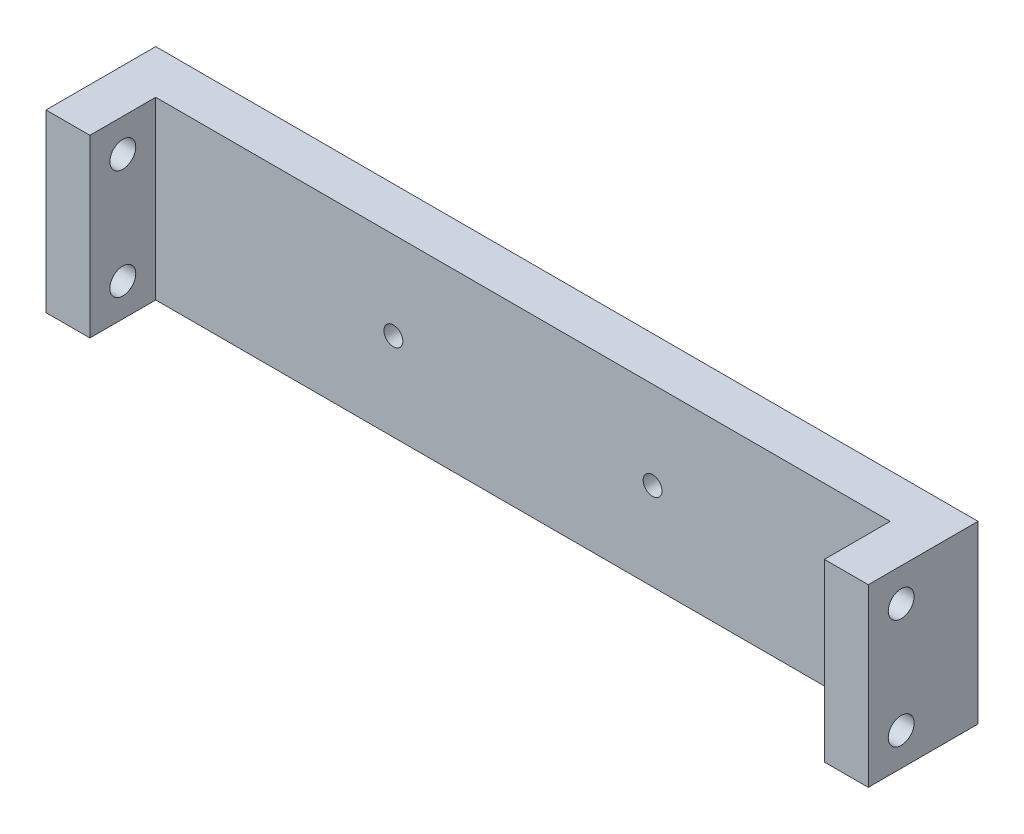
ISO-10303-21;
HEADER;
FILE_DESCRIPTION(('STEP AP214'),'2;1');
FILE_NAME('part.step','',(''),(''),'','','');
FILE_SCHEMA(('AUTOMOTIVE_DESIGN { 1 0 10303 214 1 1 1 1 }'));
ENDSEC;
DATA;
#1=APPLICATION_CONTEXT('core data for automotive mechanical design processes');
#2=APPLICATION_PROTOCOL_DEFINITION('international standard','automotive_design',2000,#1);
#3=PRODUCT_CONTEXT('',#1,'mechanical');
#4=PRODUCT('Part','Part','',(#3));
#5=PRODUCT_RELATED_PRODUCT_CATEGORY('part','',(#4));
#6=PRODUCT_DEFINITION_FORMATION('','',#4);
#7=PRODUCT_DEFINITION_CONTEXT('part definition',#1,'design');
#8=PRODUCT_DEFINITION('design','',#6,#7);
#9=PRODUCT_DEFINITION_SHAPE('','',#8);
#10=(LENGTH_UNIT() NAMED_UNIT(*) SI_UNIT(.MILLI.,.METRE.));
#11=(NAMED_UNIT(*) PLANE_ANGLE_UNIT() SI_UNIT($,.RADIAN.));
#12=(NAMED_UNIT(*) SI_UNIT($,.STERADIAN.) SOLID_ANGLE_UNIT());
#13=UNCERTAINTY_MEASURE_WITH_UNIT(LENGTH_MEASURE(1.E-05),#10,'distance_accuracy_value','');
#14=(GEOMETRIC_REPRESENTATION_CONTEXT(3) GLOBAL_UNCERTAINTY_ASSIGNED_CONTEXT((#13)) GLOBAL_UNIT_ASSIGNED_CONTEXT((#10,
#11,#12)) REPRESENTATION_CONTEXT('',''));
#15=CARTESIAN_POINT('',(0.,0.,0.));
#16=DIRECTION('',(0.,0.,1.));
#17=DIRECTION('',(1.,0.,0.));
#18=AXIS2_PLACEMENT_3D('',#15,#16,#17);
#19=CARTESIAN_POINT('',(0.,0.,5.07999999999997));
#20=DIRECTION('',(0.,1.,0.));
#21=DIRECTION('',(0.,0.,1.));
#22=AXIS2_PLACEMENT_3D('',#19,#20,#21);
#23=PLANE('',#22);
#24=DIRECTION('',(1.,0.,0.));
#25=VECTOR('',#24,1.);
#26=CARTESIAN_POINT('',(0.,0.,0.));
#27=LINE('',#26,#25);
#28=CARTESIAN_POINT('',(0.,0.,0.));
#29=VERTEX_POINT('',#28);
#30=CARTESIAN_POINT('',(95.1738,0.,0.));
#31=VERTEX_POINT('',#30);
#32=EDGE_CURVE('E212',#29,#31,#27,.T.);
#33=ORIENTED_EDGE('',*,*,#32,.T.);
#34=DIRECTION('',(0.,0.,-1.));
#35=VECTOR('',#34,1.);
#36=CARTESIAN_POINT('',(95.1738,0.,12.7));
#37=LINE('',#36,#35);
#38=CARTESIAN_POINT('',(95.1738,0.,12.7));
#39=VERTEX_POINT('',#38);
#40=EDGE_CURVE('E186',#39,#31,#37,.T.);
#41=ORIENTED_EDGE('',*,*,#40,.F.);
#42=DIRECTION('',(1.,0.,0.));
#43=VECTOR('',#42,1.);
#44=CARTESIAN_POINT('',(0.,0.,12.7));
#45=LINE('',#44,#43);
#46=CARTESIAN_POINT('',(90.0938,0.,12.7));
#47=VERTEX_POINT('',#46);
#48=EDGE_CURVE('E157',#47,#39,#45,.T.);
#49=ORIENTED_EDGE('',*,*,#48,.F.);
#50=DIRECTION('',(0.,0.,-1.));
#51=VECTOR('',#50,1.);
#52=CARTESIAN_POINT('',(90.0938,0.,12.7));
#53=LINE('',#52,#51);
#54=CARTESIAN_POINT('',(90.0938,0.,5.07999999999997));
#55=VERTEX_POINT('',#54);
#56=EDGE_CURVE('E171',#47,#55,#53,.T.);
#57=ORIENTED_EDGE('',*,*,#56,.T.);
#58=DIRECTION('',(1.,0.,0.));
#59=VECTOR('',#58,1.);
#60=CARTESIAN_POINT('',(0.,0.,5.07999999999997));
#61=LINE('',#60,#59);
#62=CARTESIAN_POINT('',(5.08000000000003,0.,5.07999999999997));
#63=VERTEX_POINT('',#62);
#64=EDGE_CURVE('E201',#63,#55,#61,.T.);
#65=ORIENTED_EDGE('',*,*,#64,.F.);
#66=DIRECTION('',(0.,0.,-1.));
#67=VECTOR('',#66,1.);
#68=CARTESIAN_POINT('',(5.08000000000003,0.,12.7));
#69=LINE('',#68,#67);
#70=CARTESIAN_POINT('',(5.08000000000003,0.,12.7));
#71=VERTEX_POINT('',#70);
#72=EDGE_CURVE('E68',#71,#63,#69,.T.);
#73=ORIENTED_EDGE('',*,*,#72,.F.);
#74=DIRECTION('',(1.,0.,0.));
#75=VECTOR('',#74,1.);
#76=CARTESIAN_POINT('',(0.,0.,12.7));
#77=LINE('',#76,#75);
#78=CARTESIAN_POINT('',(0.,0.,12.7));
#79=VERTEX_POINT('',#78);
#80=EDGE_CURVE('E129',#79,#71,#77,.T.);
#81=ORIENTED_EDGE('',*,*,#80,.F.);
#82=DIRECTION('',(0.,0.,-1.));
#83=VECTOR('',#82,1.);
#84=CARTESIAN_POINT('',(0.,0.,12.7));
#85=LINE('',#84,#83);
#86=EDGE_CURVE('E151',#79,#29,#85,.T.);
#87=ORIENTED_EDGE('',*,*,#86,.T.);
#88=EDGE_LOOP('',(#33,#41,#49,#57,#65,#73,#81,#87));
#89=FACE_BOUND('',#88,.T.);
#90=ADVANCED_FACE('F44',(#89),#23,.F.);
#91=CARTESIAN_POINT('',(62.5869,10.16,5.07999999999997));
#92=DIRECTION('',(0.,0.,-1.));
#93=DIRECTION('',(-1.,0.,0.));
#94=AXIS2_PLACEMENT_3D('',#91,#92,#93);
#95=CYLINDRICAL_SURFACE('',#94,1.0922);
#96=CARTESIAN_POINT('',(62.5869,10.16,5.07999999999997));
#97=DIRECTION('',(0.,0.,1.));
#98=DIRECTION('',(1.,0.,0.));
#99=AXIS2_PLACEMENT_3D('',#96,#97,#98);
#100=CIRCLE('',#99,1.0922);
#101=CARTESIAN_POINT('',(63.6791,10.16,5.07999999999997));
#102=VERTEX_POINT('',#101);
#103=EDGE_CURVE('E195',#102,#102,#100,.T.);
#104=ORIENTED_EDGE('',*,*,#103,.T.);
#105=EDGE_LOOP('',(#104));
#106=FACE_BOUND('',#105,.T.);
#107=CARTESIAN_POINT('',(62.5869,10.16,0.));
#108=DIRECTION('',(0.,0.,1.));
#109=DIRECTION('',(1.,0.,0.));
#110=AXIS2_PLACEMENT_3D('',#107,#108,#109);
#111=CIRCLE('',#110,1.0922);
#112=CARTESIAN_POINT('',(63.6791,10.16,0.));
#113=VERTEX_POINT('',#112);
#114=EDGE_CURVE('E209',#113,#113,#111,.T.);
#115=ORIENTED_EDGE('',*,*,#114,.F.);
#116=EDGE_LOOP('',(#115));
#117=FACE_BOUND('',#116,.T.);
#118=ADVANCED_FACE('F251',(#106,#117),#95,.F.);
#119=CARTESIAN_POINT('',(32.5869,10.16,5.07999999999997));
#120=DIRECTION('',(0.,0.,-1.));
#121=DIRECTION('',(-1.,0.,0.));
#122=AXIS2_PLACEMENT_3D('',#119,#120,#121);
#123=CYLINDRICAL_SURFACE('',#122,1.09219999999999);
#124=CARTESIAN_POINT('',(32.5869,10.16,5.07999999999997));
#125=DIRECTION('',(0.,0.,1.));
#126=DIRECTION('',(1.,0.,0.));
#127=AXIS2_PLACEMENT_3D('',#124,#125,#126);
#128=CIRCLE('',#127,1.09219999999999);
#129=CARTESIAN_POINT('',(33.6791,10.16,5.07999999999997));
#130=VERTEX_POINT('',#129);
#131=EDGE_CURVE('E191',#130,#130,#128,.T.);
#132=ORIENTED_EDGE('',*,*,#131,.T.);
#133=EDGE_LOOP('',(#132));
#134=FACE_BOUND('',#133,.T.);
#135=CARTESIAN_POINT('',(32.5869,10.16,0.));
#136=DIRECTION('',(0.,0.,1.));
#137=DIRECTION('',(1.,0.,0.));
#138=AXIS2_PLACEMENT_3D('',#135,#136,#137);
#139=CIRCLE('',#138,1.09219999999999);
#140=CARTESIAN_POINT('',(33.6791,10.16,0.));
#141=VERTEX_POINT('',#140);
#142=EDGE_CURVE('E190',#141,#141,#139,.T.);
#143=ORIENTED_EDGE('',*,*,#142,.F.);
#144=EDGE_LOOP('',(#143));
#145=FACE_BOUND('',#144,.T.);
#146=ADVANCED_FACE('F46',(#134,#145),#123,.F.);
#147=CARTESIAN_POINT('',(0.,20.32,5.07999999999997));
#148=DIRECTION('',(0.,1.,0.));
#149=DIRECTION('',(0.,0.,1.));
#150=AXIS2_PLACEMENT_3D('',#147,#148,#149);
#151=PLANE('',#150);
#152=DIRECTION('',(1.,0.,0.));
#153=VECTOR('',#152,1.);
#154=CARTESIAN_POINT('',(0.,20.32,0.));
#155=LINE('',#154,#153);
#156=CARTESIAN_POINT('',(0.,20.32,0.));
#157=VERTEX_POINT('',#156);
#158=CARTESIAN_POINT('',(95.1738,20.32,0.));
#159=VERTEX_POINT('',#158);
#160=EDGE_CURVE('E48',#157,#159,#155,.T.);
#161=ORIENTED_EDGE('',*,*,#160,.F.);
#162=DIRECTION('',(0.,0.,-1.));
#163=VECTOR('',#162,1.);
#164=CARTESIAN_POINT('',(0.,20.32,12.7));
#165=LINE('',#164,#163);
#166=CARTESIAN_POINT('',(0.,20.32,12.7));
#167=VERTEX_POINT('',#166);
#168=EDGE_CURVE('E120',#167,#157,#165,.T.);
#169=ORIENTED_EDGE('',*,*,#168,.F.);
#170=DIRECTION('',(1.,0.,0.));
#171=VECTOR('',#170,1.);
#172=CARTESIAN_POINT('',(0.,20.32,12.7));
#173=LINE('',#172,#171);
#174=CARTESIAN_POINT('',(5.08000000000003,20.32,12.7));
#175=VERTEX_POINT('',#174);
#176=EDGE_CURVE('E126',#167,#175,#173,.T.);
#177=ORIENTED_EDGE('',*,*,#176,.T.);
#178=DIRECTION('',(0.,0.,-1.));
#179=VECTOR('',#178,1.);
#180=CARTESIAN_POINT('',(5.08000000000003,20.32,12.7));
#181=LINE('',#180,#179);
#182=CARTESIAN_POINT('',(5.08000000000003,20.32,5.07999999999997));
#183=VERTEX_POINT('',#182);
#184=EDGE_CURVE('E110',#175,#183,#181,.T.);
#185=ORIENTED_EDGE('',*,*,#184,.T.);
#186=DIRECTION('',(1.,0.,0.));
#187=VECTOR('',#186,1.);
#188=CARTESIAN_POINT('',(0.,20.32,5.07999999999997));
#189=LINE('',#188,#187);
#190=CARTESIAN_POINT('',(90.0938,20.32,5.07999999999997));
#191=VERTEX_POINT('',#190);
#192=EDGE_CURVE('E11',#183,#191,#189,.T.);
#193=ORIENTED_EDGE('',*,*,#192,.T.);
#194=DIRECTION('',(0.,0.,-1.));
#195=VECTOR('',#194,1.);
#196=CARTESIAN_POINT('',(90.0938,20.32,12.7));
#197=LINE('',#196,#195);
#198=CARTESIAN_POINT('',(90.0938,20.32,12.7));
#199=VERTEX_POINT('',#198);
#200=EDGE_CURVE('E178',#199,#191,#197,.T.);
#201=ORIENTED_EDGE('',*,*,#200,.F.);
#202=DIRECTION('',(1.,0.,0.));
#203=VECTOR('',#202,1.);
#204=CARTESIAN_POINT('',(0.,20.32,12.7));
#205=LINE('',#204,#203);
#206=CARTESIAN_POINT('',(95.1738,20.32,12.7));
#207=VERTEX_POINT('',#206);
#208=EDGE_CURVE('E164',#199,#207,#205,.T.);
#209=ORIENTED_EDGE('',*,*,#208,.T.);
#210=DIRECTION('',(0.,0.,-1.));
#211=VECTOR('',#210,1.);
#212=CARTESIAN_POINT('',(95.1738,20.32,12.7));
#213=LINE('',#212,#211);
#214=EDGE_CURVE('E182',#207,#159,#213,.T.);
#215=ORIENTED_EDGE('',*,*,#214,.T.);
#216=EDGE_LOOP('',(#161,#169,#177,#185,#193,#201,#209,#215));
#217=FACE_BOUND('',#216,.T.);
#218=ADVANCED_FACE('F133',(#217),#151,.T.);
#219=CARTESIAN_POINT('',(0.,0.,5.07999999999997));
#220=DIRECTION('',(0.,0.,1.));
#221=DIRECTION('',(1.,0.,0.));
#222=AXIS2_PLACEMENT_3D('',#219,#220,#221);
#223=PLANE('',#222);
#224=ORIENTED_EDGE('',*,*,#131,.F.);
#225=EDGE_LOOP('',(#224));
#226=FACE_BOUND('',#225,.T.);
#227=ORIENTED_EDGE('',*,*,#103,.F.);
#228=EDGE_LOOP('',(#227));
#229=FACE_BOUND('',#228,.T.);
#230=DIRECTION('',(0.,-1.,0.));
#231=VECTOR('',#230,1.);
#232=CARTESIAN_POINT('',(5.08000000000003,0.,5.07999999999997));
#233=LINE('',#232,#231);
#234=EDGE_CURVE('E115',#183,#63,#233,.T.);
#235=ORIENTED_EDGE('',*,*,#234,.T.);
#236=ORIENTED_EDGE('',*,*,#64,.T.);
#237=DIRECTION('',(0.,-1.,0.));
#238=VECTOR('',#237,1.);
#239=CARTESIAN_POINT('',(90.0938,0.,5.07999999999997));
#240=LINE('',#239,#238);
#241=EDGE_CURVE('E54',#191,#55,#240,.T.);
#242=ORIENTED_EDGE('',*,*,#241,.F.);
#243=ORIENTED_EDGE('',*,*,#192,.F.);
#244=EDGE_LOOP('',(#235,#236,#242,#243));
#245=FACE_BOUND('',#244,.T.);
#246=ADVANCED_FACE('F234',(#226,#229,#245),#223,.T.);
#247=CARTESIAN_POINT('',(0.,0.,0.));
#248=DIRECTION('',(0.,0.,1.));
#249=DIRECTION('',(1.,0.,0.));
#250=AXIS2_PLACEMENT_3D('',#247,#248,#249);
#251=PLANE('',#250);
#252=ORIENTED_EDGE('',*,*,#142,.T.);
#253=EDGE_LOOP('',(#252));
#254=FACE_BOUND('',#253,.T.);
#255=ORIENTED_EDGE('',*,*,#114,.T.);
#256=EDGE_LOOP('',(#255));
#257=FACE_BOUND('',#256,.T.);
#258=ORIENTED_EDGE('',*,*,#32,.F.);
#259=DIRECTION('',(0.,1.,0.));
#260=VECTOR('',#259,1.);
#261=CARTESIAN_POINT('',(0.,0.,0.));
#262=LINE('',#261,#260);
#263=EDGE_CURVE('E131',#29,#157,#262,.T.);
#264=ORIENTED_EDGE('',*,*,#263,.T.);
#265=ORIENTED_EDGE('',*,*,#160,.T.);
#266=DIRECTION('',(0.,1.,0.));
#267=VECTOR('',#266,1.);
#268=CARTESIAN_POINT('',(95.1738,0.,0.));
#269=LINE('',#268,#267);
#270=EDGE_CURVE('E119',#31,#159,#269,.T.);
#271=ORIENTED_EDGE('',*,*,#270,.F.);
#272=EDGE_LOOP('',(#258,#264,#265,#271));
#273=FACE_BOUND('',#272,.T.);
#274=ADVANCED_FACE('F221',(#254,#257,#273),#251,.F.);
#275=CARTESIAN_POINT('',(90.0938,0.,12.7));
#276=DIRECTION('',(1.,0.,0.));
#277=DIRECTION('',(0.,0.,-1.));
#278=AXIS2_PLACEMENT_3D('',#275,#276,#277);
#279=PLANE('',#278);
#280=CARTESIAN_POINT('',(90.0938,16.51,8.89000000000001));
#281=DIRECTION('',(1.,0.,0.));
#282=DIRECTION('',(0.,0.,-1.));
#283=AXIS2_PLACEMENT_3D('',#280,#281,#282);
#284=CIRCLE('',#283,1.5);
#285=CARTESIAN_POINT('',(90.0938,16.51,7.39000000000001));
#286=VERTEX_POINT('',#285);
#287=EDGE_CURVE('E148',#286,#286,#284,.F.);
#288=ORIENTED_EDGE('',*,*,#287,.F.);
#289=EDGE_LOOP('',(#288));
#290=FACE_BOUND('',#289,.T.);
#291=CARTESIAN_POINT('',(90.0938,3.81000000000004,8.89000000000001));
#292=DIRECTION('',(1.,0.,0.));
#293=DIRECTION('',(0.,0.,-1.));
#294=AXIS2_PLACEMENT_3D('',#291,#292,#293);
#295=CIRCLE('',#294,1.5);
#296=CARTESIAN_POINT('',(90.0938,3.81000000000004,7.39000000000001));
#297=VERTEX_POINT('',#296);
#298=EDGE_CURVE('E343',#297,#297,#295,.F.);
#299=ORIENTED_EDGE('',*,*,#298,.F.);
#300=EDGE_LOOP('',(#299));
#301=FACE_BOUND('',#300,.T.);
#302=ORIENTED_EDGE('',*,*,#200,.T.);
#303=ORIENTED_EDGE('',*,*,#241,.T.);
#304=ORIENTED_EDGE('',*,*,#56,.F.);
#305=DIRECTION('',(0.,-1.,0.));
#306=VECTOR('',#305,1.);
#307=CARTESIAN_POINT('',(90.0938,0.,12.7));
#308=LINE('',#307,#306);
#309=EDGE_CURVE('E168',#199,#47,#308,.T.);
#310=ORIENTED_EDGE('',*,*,#309,.F.);
#311=EDGE_LOOP('',(#302,#303,#304,#310));
#312=FACE_BOUND('',#311,.T.);
#313=ADVANCED_FACE('F233',(#290,#301,#312),#279,.F.);
#314=CARTESIAN_POINT('',(95.1738,0.,12.7));
#315=DIRECTION('',(-1.,0.,0.));
#316=DIRECTION('',(0.,0.,1.));
#317=AXIS2_PLACEMENT_3D('',#314,#315,#316);
#318=PLANE('',#317);
#319=CARTESIAN_POINT('',(95.1738,16.51,8.89000000000001));
#320=DIRECTION('',(-1.,0.,0.));
#321=DIRECTION('',(0.,0.,1.));
#322=AXIS2_PLACEMENT_3D('',#319,#320,#321);
#323=CIRCLE('',#322,1.5);
#324=CARTESIAN_POINT('',(95.1738,16.51,10.39));
#325=VERTEX_POINT('',#324);
#326=EDGE_CURVE('E335',#325,#325,#323,.T.);
#327=ORIENTED_EDGE('',*,*,#326,.T.);
#328=EDGE_LOOP('',(#327));
#329=FACE_BOUND('',#328,.T.);
#330=CARTESIAN_POINT('',(95.1738,3.81000000000004,8.89000000000001));
#331=DIRECTION('',(-1.,0.,0.));
#332=DIRECTION('',(0.,0.,1.));
#333=AXIS2_PLACEMENT_3D('',#330,#331,#332);
#334=CIRCLE('',#333,1.5);
#335=CARTESIAN_POINT('',(95.1738,3.81000000000004,10.39));
#336=VERTEX_POINT('',#335);
#337=EDGE_CURVE('E358',#336,#336,#334,.T.);
#338=ORIENTED_EDGE('',*,*,#337,.T.);
#339=EDGE_LOOP('',(#338));
#340=FACE_BOUND('',#339,.T.);
#341=ORIENTED_EDGE('',*,*,#270,.T.);
#342=ORIENTED_EDGE('',*,*,#214,.F.);
#343=DIRECTION('',(0.,1.,0.));
#344=VECTOR('',#343,1.);
#345=CARTESIAN_POINT('',(95.1738,0.,12.7));
#346=LINE('',#345,#344);
#347=EDGE_CURVE('E161',#39,#207,#346,.T.);
#348=ORIENTED_EDGE('',*,*,#347,.F.);
#349=ORIENTED_EDGE('',*,*,#40,.T.);
#350=EDGE_LOOP('',(#341,#342,#348,#349));
#351=FACE_BOUND('',#350,.T.);
#352=ADVANCED_FACE('F226',(#329,#340,#351),#318,.F.);
#353=CARTESIAN_POINT('',(0.,0.,12.7));
#354=DIRECTION('',(0.,0.,1.));
#355=DIRECTION('',(1.,0.,0.));
#356=AXIS2_PLACEMENT_3D('',#353,#354,#355);
#357=PLANE('',#356);
#358=ORIENTED_EDGE('',*,*,#48,.T.);
#359=ORIENTED_EDGE('',*,*,#347,.T.);
#360=ORIENTED_EDGE('',*,*,#208,.F.);
#361=ORIENTED_EDGE('',*,*,#309,.T.);
#362=EDGE_LOOP('',(#358,#359,#360,#361));
#363=FACE_BOUND('',#362,.T.);
#364=ADVANCED_FACE('F230',(#363),#357,.T.);
#365=CARTESIAN_POINT('',(5.08000000000003,0.,12.7));
#366=DIRECTION('',(1.,0.,0.));
#367=DIRECTION('',(0.,1.,0.));
#368=AXIS2_PLACEMENT_3D('',#365,#366,#367);
#369=PLANE('',#368);
#370=CARTESIAN_POINT('',(5.08000000000003,16.51,8.89000000000001));
#371=DIRECTION('',(1.,0.,0.));
#372=DIRECTION('',(0.,1.,0.));
#373=AXIS2_PLACEMENT_3D('',#370,#371,#372);
#374=CIRCLE('',#373,1.5);
#375=CARTESIAN_POINT('',(5.08000000000003,18.01,8.89000000000001));
#376=VERTEX_POINT('',#375);
#377=EDGE_CURVE('E339',#376,#376,#374,.F.);
#378=ORIENTED_EDGE('',*,*,#377,.T.);
#379=EDGE_LOOP('',(#378));
#380=FACE_BOUND('',#379,.T.);
#381=CARTESIAN_POINT('',(5.08000000000003,3.81000000000004,8.89000000000001));
#382=DIRECTION('',(1.,0.,0.));
#383=DIRECTION('',(0.,1.,0.));
#384=AXIS2_PLACEMENT_3D('',#381,#382,#383);
#385=CIRCLE('',#384,1.5);
#386=CARTESIAN_POINT('',(5.08000000000003,5.31000000000003,8.89000000000001));
#387=VERTEX_POINT('',#386);
#388=EDGE_CURVE('E349',#387,#387,#385,.F.);
#389=ORIENTED_EDGE('',*,*,#388,.T.);
#390=EDGE_LOOP('',(#389));
#391=FACE_BOUND('',#390,.T.);
#392=ORIENTED_EDGE('',*,*,#234,.F.);
#393=ORIENTED_EDGE('',*,*,#184,.F.);
#394=DIRECTION('',(0.,-1.,0.));
#395=VECTOR('',#394,1.);
#396=CARTESIAN_POINT('',(5.08000000000003,0.,12.7));
#397=LINE('',#396,#395);
#398=EDGE_CURVE('E113',#175,#71,#397,.T.);
#399=ORIENTED_EDGE('',*,*,#398,.T.);
#400=ORIENTED_EDGE('',*,*,#72,.T.);
#401=EDGE_LOOP('',(#392,#393,#399,#400));
#402=FACE_BOUND('',#401,.T.);
#403=ADVANCED_FACE('F112',(#380,#391,#402),#369,.T.);
#404=CARTESIAN_POINT('',(0.,0.,12.7));
#405=DIRECTION('',(-1.,0.,0.));
#406=DIRECTION('',(0.,0.,1.));
#407=AXIS2_PLACEMENT_3D('',#404,#405,#406);
#408=PLANE('',#407);
#409=CARTESIAN_POINT('',(0.,16.51,8.89000000000001));
#410=DIRECTION('',(-1.,0.,0.));
#411=DIRECTION('',(0.,0.,1.));
#412=AXIS2_PLACEMENT_3D('',#409,#410,#411);
#413=CIRCLE('',#412,1.5);
#414=CARTESIAN_POINT('',(0.,16.51,10.39));
#415=VERTEX_POINT('',#414);
#416=EDGE_CURVE('E353',#415,#415,#413,.T.);
#417=ORIENTED_EDGE('',*,*,#416,.F.);
#418=EDGE_LOOP('',(#417));
#419=FACE_BOUND('',#418,.T.);
#420=CARTESIAN_POINT('',(0.,3.81000000000004,8.89000000000001));
#421=DIRECTION('',(-1.,0.,0.));
#422=DIRECTION('',(0.,0.,1.));
#423=AXIS2_PLACEMENT_3D('',#420,#421,#422);
#424=CIRCLE('',#423,1.5);
#425=CARTESIAN_POINT('',(0.,3.81000000000004,10.39));
#426=VERTEX_POINT('',#425);
#427=EDGE_CURVE('E354',#426,#426,#424,.T.);
#428=ORIENTED_EDGE('',*,*,#427,.F.);
#429=EDGE_LOOP('',(#428));
#430=FACE_BOUND('',#429,.T.);
#431=ORIENTED_EDGE('',*,*,#263,.F.);
#432=ORIENTED_EDGE('',*,*,#86,.F.);
#433=DIRECTION('',(0.,1.,0.));
#434=VECTOR('',#433,1.);
#435=CARTESIAN_POINT('',(0.,0.,12.7));
#436=LINE('',#435,#434);
#437=EDGE_CURVE('E136',#79,#167,#436,.T.);
#438=ORIENTED_EDGE('',*,*,#437,.T.);
#439=ORIENTED_EDGE('',*,*,#168,.T.);
#440=EDGE_LOOP('',(#431,#432,#438,#439));
#441=FACE_BOUND('',#440,.T.);
#442=ADVANCED_FACE('F236',(#419,#430,#441),#408,.T.);
#443=CARTESIAN_POINT('',(0.,0.,12.7));
#444=DIRECTION('',(0.,0.,1.));
#445=DIRECTION('',(1.,0.,0.));
#446=AXIS2_PLACEMENT_3D('',#443,#444,#445);
#447=PLANE('',#446);
#448=ORIENTED_EDGE('',*,*,#398,.F.);
#449=ORIENTED_EDGE('',*,*,#176,.F.);
#450=ORIENTED_EDGE('',*,*,#437,.F.);
#451=ORIENTED_EDGE('',*,*,#80,.T.);
#452=EDGE_LOOP('',(#448,#449,#450,#451));
#453=FACE_BOUND('',#452,.T.);
#454=ADVANCED_FACE('F124',(#453),#447,.T.);
#455=CARTESIAN_POINT('',(0.,3.81000000000004,8.89000000000001));
#456=DIRECTION('',(1.,0.,0.));
#457=DIRECTION('',(0.,0.,-1.));
#458=AXIS2_PLACEMENT_3D('',#455,#456,#457);
#459=CYLINDRICAL_SURFACE('',#458,1.5);
#460=ORIENTED_EDGE('',*,*,#388,.F.);
#461=EDGE_LOOP('',(#460));
#462=FACE_BOUND('',#461,.T.);
#463=ORIENTED_EDGE('',*,*,#427,.T.);
#464=EDGE_LOOP('',(#463));
#465=FACE_BOUND('',#464,.T.);
#466=ADVANCED_FACE('F244',(#462,#465),#459,.F.);
#467=CARTESIAN_POINT('',(0.,16.51,8.89000000000001));
#468=DIRECTION('',(1.,0.,0.));
#469=DIRECTION('',(0.,0.,-1.));
#470=AXIS2_PLACEMENT_3D('',#467,#468,#469);
#471=CYLINDRICAL_SURFACE('',#470,1.5);
#472=ORIENTED_EDGE('',*,*,#377,.F.);
#473=EDGE_LOOP('',(#472));
#474=FACE_BOUND('',#473,.T.);
#475=ORIENTED_EDGE('',*,*,#416,.T.);
#476=EDGE_LOOP('',(#475));
#477=FACE_BOUND('',#476,.T.);
#478=ADVANCED_FACE('F300',(#474,#477),#471,.F.);
#479=ORIENTED_EDGE('',*,*,#337,.F.);
#480=EDGE_LOOP('',(#479));
#481=FACE_BOUND('',#480,.T.);
#482=ORIENTED_EDGE('',*,*,#298,.T.);
#483=EDGE_LOOP('',(#482));
#484=FACE_BOUND('',#483,.T.);
#485=ADVANCED_FACE('F303',(#481,#484),#459,.F.);
#486=ORIENTED_EDGE('',*,*,#326,.F.);
#487=EDGE_LOOP('',(#486));
#488=FACE_BOUND('',#487,.T.);
#489=ORIENTED_EDGE('',*,*,#287,.T.);
#490=EDGE_LOOP('',(#489));
#491=FACE_BOUND('',#490,.T.);
#492=ADVANCED_FACE('F313',(#488,#491),#471,.F.);
#493=CLOSED_SHELL('',(#90,#118,#146,#218,#246,#274,#313,#352,#364,#403,#442,#454,#466,#478,#485,#492));
#494=MANIFOLD_SOLID_BREP('B2',#493);
#495=ADVANCED_BREP_SHAPE_REPRESENTATION('',(#18,#494),#14);
#496=SHAPE_DEFINITION_REPRESENTATION(#9,#495);
ENDSEC;
END-ISO-10303-21;
